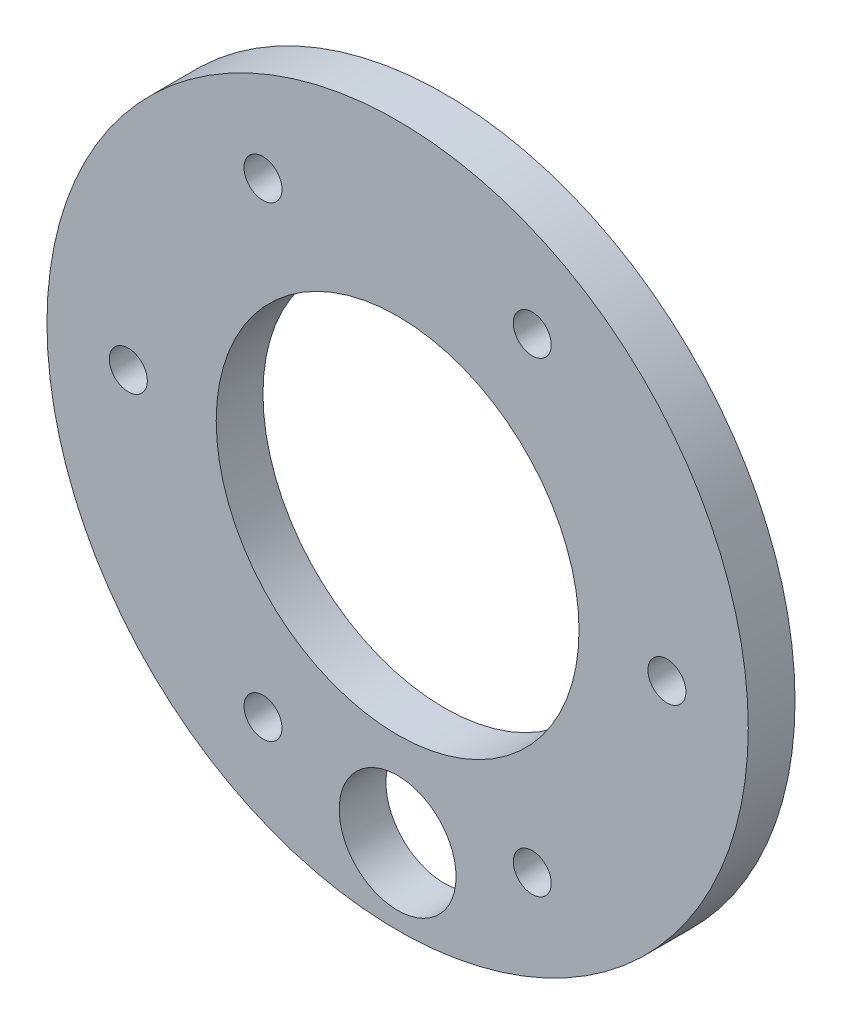
ISO-10303-21;
HEADER;
FILE_DESCRIPTION(('STEP AP214'),'2;1');
FILE_NAME('part.step','',(''),(''),'','','');
FILE_SCHEMA(('AUTOMOTIVE_DESIGN { 1 0 10303 214 1 1 1 1 }'));
ENDSEC;
DATA;
#1=APPLICATION_CONTEXT('core data for automotive mechanical design processes');
#2=APPLICATION_PROTOCOL_DEFINITION('international standard','automotive_design',2000,#1);
#3=PRODUCT_CONTEXT('',#1,'mechanical');
#4=PRODUCT('Part','Part','',(#3));
#5=PRODUCT_RELATED_PRODUCT_CATEGORY('part','',(#4));
#6=PRODUCT_DEFINITION_FORMATION('','',#4);
#7=PRODUCT_DEFINITION_CONTEXT('part definition',#1,'design');
#8=PRODUCT_DEFINITION('design','',#6,#7);
#9=PRODUCT_DEFINITION_SHAPE('','',#8);
#10=(LENGTH_UNIT() NAMED_UNIT(*) SI_UNIT(.MILLI.,.METRE.));
#11=(NAMED_UNIT(*) PLANE_ANGLE_UNIT() SI_UNIT($,.RADIAN.));
#12=(NAMED_UNIT(*) SI_UNIT($,.STERADIAN.) SOLID_ANGLE_UNIT());
#13=UNCERTAINTY_MEASURE_WITH_UNIT(LENGTH_MEASURE(1.E-05),#10,'distance_accuracy_value','');
#14=(GEOMETRIC_REPRESENTATION_CONTEXT(3) GLOBAL_UNCERTAINTY_ASSIGNED_CONTEXT((#13)) GLOBAL_UNIT_ASSIGNED_CONTEXT((#10,
#11,#12)) REPRESENTATION_CONTEXT('',''));
#15=CARTESIAN_POINT('',(0.,0.,0.));
#16=DIRECTION('',(0.,0.,1.));
#17=DIRECTION('',(1.,0.,0.));
#18=AXIS2_PLACEMENT_3D('',#15,#16,#17);
#19=CARTESIAN_POINT('',(95.25,95.25,12.7));
#20=DIRECTION('',(0.,0.,-1.));
#21=DIRECTION('',(-1.,0.,0.));
#22=AXIS2_PLACEMENT_3D('',#19,#20,#21);
#23=CYLINDRICAL_SURFACE('',#22,95.25);
#24=CARTESIAN_POINT('',(95.25,95.25,12.7));
#25=DIRECTION('',(0.,0.,1.));
#26=DIRECTION('',(1.,0.,0.));
#27=AXIS2_PLACEMENT_3D('',#24,#25,#26);
#28=CIRCLE('',#27,95.25);
#29=CARTESIAN_POINT('',(190.5,95.25,12.7));
#30=VERTEX_POINT('',#29);
#31=EDGE_CURVE('E10',#30,#30,#28,.T.);
#32=ORIENTED_EDGE('',*,*,#31,.F.);
#33=EDGE_LOOP('',(#32));
#34=FACE_BOUND('',#33,.T.);
#35=CARTESIAN_POINT('',(95.25,95.25,0.));
#36=DIRECTION('',(0.,0.,1.));
#37=DIRECTION('',(1.,0.,0.));
#38=AXIS2_PLACEMENT_3D('',#35,#36,#37);
#39=CIRCLE('',#38,95.25);
#40=CARTESIAN_POINT('',(190.5,95.25,0.));
#41=VERTEX_POINT('',#40);
#42=EDGE_CURVE('E40',#41,#41,#39,.T.);
#43=ORIENTED_EDGE('',*,*,#42,.T.);
#44=EDGE_LOOP('',(#43));
#45=FACE_BOUND('',#44,.T.);
#46=ADVANCED_FACE('F37',(#34,#45),#23,.T.);
#47=CARTESIAN_POINT('',(95.25,95.25,12.7));
#48=DIRECTION('',(0.,0.,1.));
#49=DIRECTION('',(1.,0.,0.));
#50=AXIS2_PLACEMENT_3D('',#47,#48,#49);
#51=PLANE('',#50);
#52=CARTESIAN_POINT('',(95.25,20.574,12.7));
#53=DIRECTION('',(0.,0.,1.));
#54=DIRECTION('',(1.,0.,0.));
#55=AXIS2_PLACEMENT_3D('',#52,#53,#54);
#56=CIRCLE('',#55,15.875);
#57=CARTESIAN_POINT('',(111.125,20.574,12.7));
#58=VERTEX_POINT('',#57);
#59=EDGE_CURVE('E65',#58,#58,#56,.T.);
#60=ORIENTED_EDGE('',*,*,#59,.F.);
#61=EDGE_LOOP('',(#60));
#62=FACE_BOUND('',#61,.T.);
#63=CARTESIAN_POINT('',(22.1002352,95.25,12.7));
#64=DIRECTION('',(0.,0.,1.));
#65=DIRECTION('',(0.5,-0.866025403784439,0.));
#66=AXIS2_PLACEMENT_3D('',#63,#64,#65);
#67=CIRCLE('',#66,5.1562);
#68=CARTESIAN_POINT('',(24.6783352,90.7845998130067,12.7));
#69=VERTEX_POINT('',#68);
#70=EDGE_CURVE('E58',#69,#69,#67,.T.);
#71=ORIENTED_EDGE('',*,*,#70,.F.);
#72=EDGE_LOOP('',(#71));
#73=FACE_BOUND('',#72,.T.);
#74=CARTESIAN_POINT('',(58.6751176,158.599554597657,12.7));
#75=DIRECTION('',(0.,0.,1.));
#76=DIRECTION('',(-0.5,-0.866025403784439,0.));
#77=AXIS2_PLACEMENT_3D('',#74,#75,#76);
#78=CIRCLE('',#77,5.1562);
#79=CARTESIAN_POINT('',(56.0970176,154.134154410663,12.7));
#80=VERTEX_POINT('',#79);
#81=EDGE_CURVE('E83',#80,#80,#78,.T.);
#82=ORIENTED_EDGE('',*,*,#81,.F.);
#83=EDGE_LOOP('',(#82));
#84=FACE_BOUND('',#83,.T.);
#85=CARTESIAN_POINT('',(131.8248824,158.599554597657,12.7));
#86=DIRECTION('',(0.,0.,1.));
#87=DIRECTION('',(-1.,0.,0.));
#88=AXIS2_PLACEMENT_3D('',#85,#86,#87);
#89=CIRCLE('',#88,5.1562);
#90=CARTESIAN_POINT('',(126.6686824,158.599554597657,12.7));
#91=VERTEX_POINT('',#90);
#92=EDGE_CURVE('E77',#91,#91,#89,.T.);
#93=ORIENTED_EDGE('',*,*,#92,.F.);
#94=EDGE_LOOP('',(#93));
#95=FACE_BOUND('',#94,.T.);
#96=CARTESIAN_POINT('',(168.3997648,95.25,12.7));
#97=DIRECTION('',(0.,0.,1.));
#98=DIRECTION('',(-0.5,0.866025403784438,0.));
#99=AXIS2_PLACEMENT_3D('',#96,#97,#98);
#100=CIRCLE('',#99,5.1562);
#101=CARTESIAN_POINT('',(165.8216648,99.7154001869934,12.7));
#102=VERTEX_POINT('',#101);
#103=EDGE_CURVE('E71',#102,#102,#100,.T.);
#104=ORIENTED_EDGE('',*,*,#103,.F.);
#105=EDGE_LOOP('',(#104));
#106=FACE_BOUND('',#105,.T.);
#107=CARTESIAN_POINT('',(131.8248824,31.9004454023433,12.7));
#108=DIRECTION('',(0.,0.,1.));
#109=DIRECTION('',(0.499999999999999,0.866025403784439,0.));
#110=AXIS2_PLACEMENT_3D('',#107,#108,#109);
#111=CIRCLE('',#110,5.1562);
#112=CARTESIAN_POINT('',(134.4029824,36.3658455893366,12.7));
#113=VERTEX_POINT('',#112);
#114=EDGE_CURVE('E64',#113,#113,#111,.T.);
#115=ORIENTED_EDGE('',*,*,#114,.F.);
#116=EDGE_LOOP('',(#115));
#117=FACE_BOUND('',#116,.T.);
#118=CARTESIAN_POINT('',(58.6751176,31.9004454023433,12.7));
#119=DIRECTION('',(0.,0.,1.));
#120=DIRECTION('',(1.,0.,0.));
#121=AXIS2_PLACEMENT_3D('',#118,#119,#120);
#122=CIRCLE('',#121,5.1562);
#123=CARTESIAN_POINT('',(63.8313176,31.9004454023433,12.7));
#124=VERTEX_POINT('',#123);
#125=EDGE_CURVE('E52',#124,#124,#122,.T.);
#126=ORIENTED_EDGE('',*,*,#125,.F.);
#127=EDGE_LOOP('',(#126));
#128=FACE_BOUND('',#127,.T.);
#129=CARTESIAN_POINT('',(95.25,95.25,12.7));
#130=DIRECTION('',(0.,0.,1.));
#131=DIRECTION('',(1.,0.,0.));
#132=AXIS2_PLACEMENT_3D('',#129,#130,#131);
#133=CIRCLE('',#132,49.276);
#134=CARTESIAN_POINT('',(144.526,95.25,12.7));
#135=VERTEX_POINT('',#134);
#136=EDGE_CURVE('E47',#135,#135,#133,.T.);
#137=ORIENTED_EDGE('',*,*,#136,.F.);
#138=EDGE_LOOP('',(#137));
#139=FACE_BOUND('',#138,.T.);
#140=ORIENTED_EDGE('',*,*,#31,.T.);
#141=EDGE_LOOP('',(#140));
#142=FACE_BOUND('',#141,.T.);
#143=ADVANCED_FACE('F100',(#62,#73,#84,#95,#106,#117,#128,#139,#142),#51,.T.);
#144=CARTESIAN_POINT('',(95.25,95.25,0.));
#145=DIRECTION('',(0.,0.,1.));
#146=DIRECTION('',(1.,0.,0.));
#147=AXIS2_PLACEMENT_3D('',#144,#145,#146);
#148=PLANE('',#147);
#149=CARTESIAN_POINT('',(95.25,20.574,0.));
#150=DIRECTION('',(0.,0.,1.));
#151=DIRECTION('',(1.,0.,0.));
#152=AXIS2_PLACEMENT_3D('',#149,#150,#151);
#153=CIRCLE('',#152,15.875);
#154=CARTESIAN_POINT('',(111.125,20.574,0.));
#155=VERTEX_POINT('',#154);
#156=EDGE_CURVE('E91',#155,#155,#153,.T.);
#157=ORIENTED_EDGE('',*,*,#156,.T.);
#158=EDGE_LOOP('',(#157));
#159=FACE_BOUND('',#158,.T.);
#160=CARTESIAN_POINT('',(22.1002352,95.25,0.));
#161=DIRECTION('',(0.,0.,1.));
#162=DIRECTION('',(0.5,-0.866025403784439,0.));
#163=AXIS2_PLACEMENT_3D('',#160,#161,#162);
#164=CIRCLE('',#163,5.1562);
#165=CARTESIAN_POINT('',(24.6783352,90.7845998130067,0.));
#166=VERTEX_POINT('',#165);
#167=EDGE_CURVE('E86',#166,#166,#164,.T.);
#168=ORIENTED_EDGE('',*,*,#167,.T.);
#169=EDGE_LOOP('',(#168));
#170=FACE_BOUND('',#169,.T.);
#171=CARTESIAN_POINT('',(58.6751176,158.599554597657,0.));
#172=DIRECTION('',(0.,0.,1.));
#173=DIRECTION('',(-0.5,-0.866025403784439,0.));
#174=AXIS2_PLACEMENT_3D('',#171,#172,#173);
#175=CIRCLE('',#174,5.1562);
#176=CARTESIAN_POINT('',(56.0970176,154.134154410663,0.));
#177=VERTEX_POINT('',#176);
#178=EDGE_CURVE('E80',#177,#177,#175,.T.);
#179=ORIENTED_EDGE('',*,*,#178,.T.);
#180=EDGE_LOOP('',(#179));
#181=FACE_BOUND('',#180,.T.);
#182=CARTESIAN_POINT('',(131.8248824,158.599554597657,0.));
#183=DIRECTION('',(0.,0.,1.));
#184=DIRECTION('',(-1.,0.,0.));
#185=AXIS2_PLACEMENT_3D('',#182,#183,#184);
#186=CIRCLE('',#185,5.1562);
#187=CARTESIAN_POINT('',(126.6686824,158.599554597657,0.));
#188=VERTEX_POINT('',#187);
#189=EDGE_CURVE('E74',#188,#188,#186,.T.);
#190=ORIENTED_EDGE('',*,*,#189,.T.);
#191=EDGE_LOOP('',(#190));
#192=FACE_BOUND('',#191,.T.);
#193=CARTESIAN_POINT('',(168.3997648,95.25,0.));
#194=DIRECTION('',(0.,0.,1.));
#195=DIRECTION('',(-0.5,0.866025403784438,0.));
#196=AXIS2_PLACEMENT_3D('',#193,#194,#195);
#197=CIRCLE('',#196,5.1562);
#198=CARTESIAN_POINT('',(165.8216648,99.7154001869934,0.));
#199=VERTEX_POINT('',#198);
#200=EDGE_CURVE('E68',#199,#199,#197,.T.);
#201=ORIENTED_EDGE('',*,*,#200,.T.);
#202=EDGE_LOOP('',(#201));
#203=FACE_BOUND('',#202,.T.);
#204=CARTESIAN_POINT('',(131.8248824,31.9004454023433,0.));
#205=DIRECTION('',(0.,0.,1.));
#206=DIRECTION('',(0.499999999999999,0.866025403784439,0.));
#207=AXIS2_PLACEMENT_3D('',#204,#205,#206);
#208=CIRCLE('',#207,5.1562);
#209=CARTESIAN_POINT('',(134.4029824,36.3658455893366,0.));
#210=VERTEX_POINT('',#209);
#211=EDGE_CURVE('E61',#210,#210,#208,.T.);
#212=ORIENTED_EDGE('',*,*,#211,.T.);
#213=EDGE_LOOP('',(#212));
#214=FACE_BOUND('',#213,.T.);
#215=CARTESIAN_POINT('',(58.6751176,31.9004454023433,0.));
#216=DIRECTION('',(0.,0.,1.));
#217=DIRECTION('',(1.,0.,0.));
#218=AXIS2_PLACEMENT_3D('',#215,#216,#217);
#219=CIRCLE('',#218,5.1562);
#220=CARTESIAN_POINT('',(63.8313176,31.9004454023433,0.));
#221=VERTEX_POINT('',#220);
#222=EDGE_CURVE('E55',#221,#221,#219,.T.);
#223=ORIENTED_EDGE('',*,*,#222,.T.);
#224=EDGE_LOOP('',(#223));
#225=FACE_BOUND('',#224,.T.);
#226=CARTESIAN_POINT('',(95.25,95.25,0.));
#227=DIRECTION('',(0.,0.,1.));
#228=DIRECTION('',(1.,0.,0.));
#229=AXIS2_PLACEMENT_3D('',#226,#227,#228);
#230=CIRCLE('',#229,49.276);
#231=CARTESIAN_POINT('',(144.526,95.25,0.));
#232=VERTEX_POINT('',#231);
#233=EDGE_CURVE('E49',#232,#232,#230,.T.);
#234=ORIENTED_EDGE('',*,*,#233,.T.);
#235=EDGE_LOOP('',(#234));
#236=FACE_BOUND('',#235,.T.);
#237=ORIENTED_EDGE('',*,*,#42,.F.);
#238=EDGE_LOOP('',(#237));
#239=FACE_BOUND('',#238,.T.);
#240=ADVANCED_FACE('F103',(#159,#170,#181,#192,#203,#214,#225,#236,#239),#148,.F.);
#241=CARTESIAN_POINT('',(95.25,95.25,12.7));
#242=DIRECTION('',(0.,0.,-1.));
#243=DIRECTION('',(-1.,0.,0.));
#244=AXIS2_PLACEMENT_3D('',#241,#242,#243);
#245=CYLINDRICAL_SURFACE('',#244,49.276);
#246=ORIENTED_EDGE('',*,*,#136,.T.);
#247=EDGE_LOOP('',(#246));
#248=FACE_BOUND('',#247,.T.);
#249=ORIENTED_EDGE('',*,*,#233,.F.);
#250=EDGE_LOOP('',(#249));
#251=FACE_BOUND('',#250,.T.);
#252=ADVANCED_FACE('F119',(#248,#251),#245,.F.);
#253=CARTESIAN_POINT('',(58.6751176,31.9004454023433,12.7));
#254=DIRECTION('',(0.,0.,-1.));
#255=DIRECTION('',(-1.,0.,0.));
#256=AXIS2_PLACEMENT_3D('',#253,#254,#255);
#257=CYLINDRICAL_SURFACE('',#256,5.1562);
#258=ORIENTED_EDGE('',*,*,#125,.T.);
#259=EDGE_LOOP('',(#258));
#260=FACE_BOUND('',#259,.T.);
#261=ORIENTED_EDGE('',*,*,#222,.F.);
#262=EDGE_LOOP('',(#261));
#263=FACE_BOUND('',#262,.T.);
#264=ADVANCED_FACE('F122',(#260,#263),#257,.F.);
#265=CARTESIAN_POINT('',(131.8248824,31.9004454023433,12.7));
#266=DIRECTION('',(0.,0.,-1.));
#267=DIRECTION('',(-1.,0.,0.));
#268=AXIS2_PLACEMENT_3D('',#265,#266,#267);
#269=CYLINDRICAL_SURFACE('',#268,5.1562);
#270=ORIENTED_EDGE('',*,*,#114,.T.);
#271=EDGE_LOOP('',(#270));
#272=FACE_BOUND('',#271,.T.);
#273=ORIENTED_EDGE('',*,*,#211,.F.);
#274=EDGE_LOOP('',(#273));
#275=FACE_BOUND('',#274,.T.);
#276=ADVANCED_FACE('F149',(#272,#275),#269,.F.);
#277=CARTESIAN_POINT('',(168.3997648,95.25,12.7));
#278=DIRECTION('',(0.,0.,-1.));
#279=DIRECTION('',(-1.,0.,0.));
#280=AXIS2_PLACEMENT_3D('',#277,#278,#279);
#281=CYLINDRICAL_SURFACE('',#280,5.1562);
#282=ORIENTED_EDGE('',*,*,#103,.T.);
#283=EDGE_LOOP('',(#282));
#284=FACE_BOUND('',#283,.T.);
#285=ORIENTED_EDGE('',*,*,#200,.F.);
#286=EDGE_LOOP('',(#285));
#287=FACE_BOUND('',#286,.T.);
#288=ADVANCED_FACE('F158',(#284,#287),#281,.F.);
#289=CARTESIAN_POINT('',(131.8248824,158.599554597657,12.7));
#290=DIRECTION('',(0.,0.,-1.));
#291=DIRECTION('',(-1.,0.,0.));
#292=AXIS2_PLACEMENT_3D('',#289,#290,#291);
#293=CYLINDRICAL_SURFACE('',#292,5.1562);
#294=ORIENTED_EDGE('',*,*,#92,.T.);
#295=EDGE_LOOP('',(#294));
#296=FACE_BOUND('',#295,.T.);
#297=ORIENTED_EDGE('',*,*,#189,.F.);
#298=EDGE_LOOP('',(#297));
#299=FACE_BOUND('',#298,.T.);
#300=ADVANCED_FACE('F167',(#296,#299),#293,.F.);
#301=CARTESIAN_POINT('',(58.6751176,158.599554597657,12.7));
#302=DIRECTION('',(0.,0.,-1.));
#303=DIRECTION('',(-1.,0.,0.));
#304=AXIS2_PLACEMENT_3D('',#301,#302,#303);
#305=CYLINDRICAL_SURFACE('',#304,5.1562);
#306=ORIENTED_EDGE('',*,*,#81,.T.);
#307=EDGE_LOOP('',(#306));
#308=FACE_BOUND('',#307,.T.);
#309=ORIENTED_EDGE('',*,*,#178,.F.);
#310=EDGE_LOOP('',(#309));
#311=FACE_BOUND('',#310,.T.);
#312=ADVANCED_FACE('F176',(#308,#311),#305,.F.);
#313=CARTESIAN_POINT('',(22.1002352,95.25,12.7));
#314=DIRECTION('',(0.,0.,-1.));
#315=DIRECTION('',(-1.,0.,0.));
#316=AXIS2_PLACEMENT_3D('',#313,#314,#315);
#317=CYLINDRICAL_SURFACE('',#316,5.1562);
#318=ORIENTED_EDGE('',*,*,#70,.T.);
#319=EDGE_LOOP('',(#318));
#320=FACE_BOUND('',#319,.T.);
#321=ORIENTED_EDGE('',*,*,#167,.F.);
#322=EDGE_LOOP('',(#321));
#323=FACE_BOUND('',#322,.T.);
#324=ADVANCED_FACE('F185',(#320,#323),#317,.F.);
#325=CARTESIAN_POINT('',(95.25,20.574,12.7));
#326=DIRECTION('',(0.,0.,-1.));
#327=DIRECTION('',(-1.,0.,0.));
#328=AXIS2_PLACEMENT_3D('',#325,#326,#327);
#329=CYLINDRICAL_SURFACE('',#328,15.875);
#330=ORIENTED_EDGE('',*,*,#59,.T.);
#331=EDGE_LOOP('',(#330));
#332=FACE_BOUND('',#331,.T.);
#333=ORIENTED_EDGE('',*,*,#156,.F.);
#334=EDGE_LOOP('',(#333));
#335=FACE_BOUND('',#334,.T.);
#336=ADVANCED_FACE('F97',(#332,#335),#329,.F.);
#337=CLOSED_SHELL('',(#46,#143,#240,#252,#264,#276,#288,#300,#312,#324,#336));
#338=MANIFOLD_SOLID_BREP('B2',#337);
#339=ADVANCED_BREP_SHAPE_REPRESENTATION('',(#18,#338),#14);
#340=SHAPE_DEFINITION_REPRESENTATION(#9,#339);
ENDSEC;
END-ISO-10303-21;
